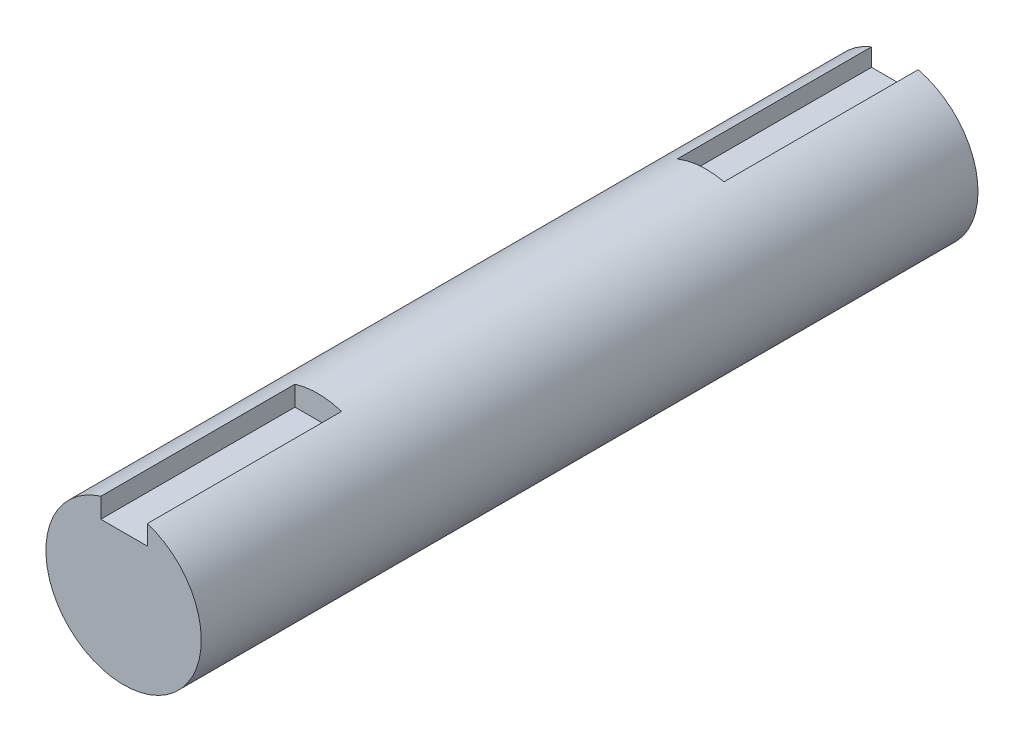
ISO-10303-21;
HEADER;
FILE_DESCRIPTION(('STEP AP214'),'2;1');
FILE_NAME('part.step','',(''),(''),'','','');
FILE_SCHEMA(('AUTOMOTIVE_DESIGN { 1 0 10303 214 1 1 1 1 }'));
ENDSEC;
DATA;
#1=APPLICATION_CONTEXT('core data for automotive mechanical design processes');
#2=APPLICATION_PROTOCOL_DEFINITION('international standard','automotive_design',2000,#1);
#3=PRODUCT_CONTEXT('',#1,'mechanical');
#4=PRODUCT('Part','Part','',(#3));
#5=PRODUCT_RELATED_PRODUCT_CATEGORY('part','',(#4));
#6=PRODUCT_DEFINITION_FORMATION('','',#4);
#7=PRODUCT_DEFINITION_CONTEXT('part definition',#1,'design');
#8=PRODUCT_DEFINITION('design','',#6,#7);
#9=PRODUCT_DEFINITION_SHAPE('','',#8);
#10=(LENGTH_UNIT() NAMED_UNIT(*) SI_UNIT(.MILLI.,.METRE.));
#11=(NAMED_UNIT(*) PLANE_ANGLE_UNIT() SI_UNIT($,.RADIAN.));
#12=(NAMED_UNIT(*) SI_UNIT($,.STERADIAN.) SOLID_ANGLE_UNIT());
#13=UNCERTAINTY_MEASURE_WITH_UNIT(LENGTH_MEASURE(1.E-05),#10,'distance_accuracy_value','');
#14=(GEOMETRIC_REPRESENTATION_CONTEXT(3) GLOBAL_UNCERTAINTY_ASSIGNED_CONTEXT((#13)) GLOBAL_UNIT_ASSIGNED_CONTEXT((#10,
#11,#12)) REPRESENTATION_CONTEXT('',''));
#15=CARTESIAN_POINT('',(0.,0.,0.));
#16=DIRECTION('',(0.,0.,1.));
#17=DIRECTION('',(1.,0.,0.));
#18=AXIS2_PLACEMENT_3D('',#15,#16,#17);
#19=CARTESIAN_POINT('',(0.,0.,0.));
#20=DIRECTION('',(0.,0.,1.));
#21=DIRECTION('',(1.,0.,0.));
#22=AXIS2_PLACEMENT_3D('',#19,#20,#21);
#23=PLANE('',#22);
#24=DIRECTION('',(0.,-1.,0.));
#25=VECTOR('',#24,1.);
#26=CARTESIAN_POINT('',(2.29320418851105,10.,0.));
#27=LINE('',#26,#25);
#28=CARTESIAN_POINT('',(2.29320418851105,9.73350987823999,0.));
#29=VERTEX_POINT('',#28);
#30=CARTESIAN_POINT('',(2.29320418851105,7.,0.));
#31=VERTEX_POINT('',#30);
#32=EDGE_CURVE('E150',#29,#31,#27,.T.);
#33=ORIENTED_EDGE('',*,*,#32,.F.);
#34=CARTESIAN_POINT('',(0.,0.,0.));
#35=DIRECTION('',(0.,0.,1.));
#36=DIRECTION('',(1.,0.,0.));
#37=AXIS2_PLACEMENT_3D('',#34,#35,#36);
#38=CIRCLE('',#37,10.);
#39=CARTESIAN_POINT('',(-3.70679581148895,9.28760813191039,0.));
#40=VERTEX_POINT('',#39);
#41=EDGE_CURVE('E161',#40,#29,#38,.T.);
#42=ORIENTED_EDGE('',*,*,#41,.F.);
#43=DIRECTION('',(0.,1.,0.));
#44=VECTOR('',#43,1.);
#45=CARTESIAN_POINT('',(-3.70679581148895,7.,0.));
#46=LINE('',#45,#44);
#47=CARTESIAN_POINT('',(-3.70679581148895,7.,0.));
#48=VERTEX_POINT('',#47);
#49=EDGE_CURVE('E143',#48,#40,#46,.T.);
#50=ORIENTED_EDGE('',*,*,#49,.F.);
#51=DIRECTION('',(-1.,0.,0.));
#52=VECTOR('',#51,1.);
#53=CARTESIAN_POINT('',(2.29320418851105,7.,0.));
#54=LINE('',#53,#52);
#55=EDGE_CURVE('E140',#31,#48,#54,.T.);
#56=ORIENTED_EDGE('',*,*,#55,.F.);
#57=EDGE_LOOP('',(#33,#42,#50,#56));
#58=FACE_BOUND('',#57,.T.);
#59=ADVANCED_FACE('F39',(#58),#23,.F.);
#60=CARTESIAN_POINT('',(0.,0.,100.));
#61=DIRECTION('',(0.,0.,-1.));
#62=DIRECTION('',(-1.,0.,0.));
#63=AXIS2_PLACEMENT_3D('',#60,#61,#62);
#64=CYLINDRICAL_SURFACE('',#63,10.);
#65=CARTESIAN_POINT('',(0.,0.,100.));
#66=DIRECTION('',(0.,0.,1.));
#67=DIRECTION('',(1.,0.,0.));
#68=AXIS2_PLACEMENT_3D('',#65,#66,#67);
#69=CIRCLE('',#68,10.);
#70=CARTESIAN_POINT('',(-2.93610987251853,9.5592499086748,100.));
#71=VERTEX_POINT('',#70);
#72=CARTESIAN_POINT('',(3.06389012748147,9.51906388710159,100.));
#73=VERTEX_POINT('',#72);
#74=EDGE_CURVE('E149',#71,#73,#69,.T.);
#75=ORIENTED_EDGE('',*,*,#74,.F.);
#76=DIRECTION('',(0.,0.,-1.));
#77=VECTOR('',#76,1.);
#78=CARTESIAN_POINT('',(-2.93610987251853,9.5592499086748,100.));
#79=LINE('',#78,#77);
#80=CARTESIAN_POINT('',(-2.93610987251853,9.5592499086748,75.));
#81=VERTEX_POINT('',#80);
#82=EDGE_CURVE('E134',#71,#81,#79,.T.);
#83=ORIENTED_EDGE('',*,*,#82,.T.);
#84=CARTESIAN_POINT('',(0.,0.,75.));
#85=DIRECTION('',(0.,0.,1.));
#86=DIRECTION('',(1.,0.,0.));
#87=AXIS2_PLACEMENT_3D('',#84,#85,#86);
#88=CIRCLE('',#87,10.);
#89=CARTESIAN_POINT('',(3.06389012748147,9.51906388710159,75.));
#90=VERTEX_POINT('',#89);
#91=EDGE_CURVE('E11',#90,#81,#88,.T.);
#92=ORIENTED_EDGE('',*,*,#91,.F.);
#93=DIRECTION('',(0.,0.,-1.));
#94=VECTOR('',#93,1.);
#95=CARTESIAN_POINT('',(3.06389012748147,9.51906388710158,100.));
#96=LINE('',#95,#94);
#97=EDGE_CURVE('E131',#90,#73,#96,.F.);
#98=ORIENTED_EDGE('',*,*,#97,.T.);
#99=EDGE_LOOP('',(#75,#83,#92,#98));
#100=FACE_BOUND('',#99,.T.);
#101=ORIENTED_EDGE('',*,*,#41,.T.);
#102=DIRECTION('',(0.,0.,-1.));
#103=VECTOR('',#102,1.);
#104=CARTESIAN_POINT('',(2.29320418851105,9.73350987823998,100.));
#105=LINE('',#104,#103);
#106=CARTESIAN_POINT('',(2.29320418851105,9.73350987823999,25.));
#107=VERTEX_POINT('',#106);
#108=EDGE_CURVE('E158',#29,#107,#105,.F.);
#109=ORIENTED_EDGE('',*,*,#108,.T.);
#110=CARTESIAN_POINT('',(0.,0.,25.));
#111=DIRECTION('',(0.,0.,-1.));
#112=DIRECTION('',(-1.,0.,0.));
#113=AXIS2_PLACEMENT_3D('',#110,#111,#112);
#114=CIRCLE('',#113,10.);
#115=CARTESIAN_POINT('',(-3.70679581148895,9.28760813191039,25.));
#116=VERTEX_POINT('',#115);
#117=EDGE_CURVE('E130',#116,#107,#114,.T.);
#118=ORIENTED_EDGE('',*,*,#117,.F.);
#119=DIRECTION('',(0.,0.,-1.));
#120=VECTOR('',#119,1.);
#121=CARTESIAN_POINT('',(-3.70679581148895,9.28760813191039,100.));
#122=LINE('',#121,#120);
#123=EDGE_CURVE('E152',#116,#40,#122,.T.);
#124=ORIENTED_EDGE('',*,*,#123,.T.);
#125=EDGE_LOOP('',(#101,#109,#118,#124));
#126=FACE_BOUND('',#125,.T.);
#127=ADVANCED_FACE('F41',(#100,#126),#64,.T.);
#128=CARTESIAN_POINT('',(0.,0.,100.));
#129=DIRECTION('',(0.,0.,1.));
#130=DIRECTION('',(1.,0.,0.));
#131=AXIS2_PLACEMENT_3D('',#128,#129,#130);
#132=PLANE('',#131);
#133=DIRECTION('',(0.,-1.,0.));
#134=VECTOR('',#133,1.);
#135=CARTESIAN_POINT('',(-2.93610987251853,10.,100.));
#136=LINE('',#135,#134);
#137=CARTESIAN_POINT('',(-2.93610987251853,7.,100.));
#138=VERTEX_POINT('',#137);
#139=EDGE_CURVE('E50',#71,#138,#136,.T.);
#140=ORIENTED_EDGE('',*,*,#139,.F.);
#141=ORIENTED_EDGE('',*,*,#74,.T.);
#142=DIRECTION('',(0.,1.,0.));
#143=VECTOR('',#142,1.);
#144=CARTESIAN_POINT('',(3.06389012748147,7.,100.));
#145=LINE('',#144,#143);
#146=CARTESIAN_POINT('',(3.06389012748147,7.,100.));
#147=VERTEX_POINT('',#146);
#148=EDGE_CURVE('E114',#147,#73,#145,.T.);
#149=ORIENTED_EDGE('',*,*,#148,.F.);
#150=DIRECTION('',(1.,0.,0.));
#151=VECTOR('',#150,1.);
#152=CARTESIAN_POINT('',(-2.93610987251853,7.,100.));
#153=LINE('',#152,#151);
#154=EDGE_CURVE('E126',#138,#147,#153,.T.);
#155=ORIENTED_EDGE('',*,*,#154,.F.);
#156=EDGE_LOOP('',(#140,#141,#149,#155));
#157=FACE_BOUND('',#156,.T.);
#158=ADVANCED_FACE('F194',(#157),#132,.T.);
#159=CARTESIAN_POINT('',(0.,0.,25.));
#160=DIRECTION('',(0.,0.,-1.));
#161=DIRECTION('',(-1.,0.,0.));
#162=AXIS2_PLACEMENT_3D('',#159,#160,#161);
#163=PLANE('',#162);
#164=DIRECTION('',(0.,1.,0.));
#165=VECTOR('',#164,1.);
#166=CARTESIAN_POINT('',(-3.70679581148895,7.,25.));
#167=LINE('',#166,#165);
#168=CARTESIAN_POINT('',(-3.70679581148895,7.,25.));
#169=VERTEX_POINT('',#168);
#170=EDGE_CURVE('E145',#169,#116,#167,.T.);
#171=ORIENTED_EDGE('',*,*,#170,.T.);
#172=ORIENTED_EDGE('',*,*,#117,.T.);
#173=DIRECTION('',(0.,-1.,0.));
#174=VECTOR('',#173,1.);
#175=CARTESIAN_POINT('',(2.29320418851105,10.,25.));
#176=LINE('',#175,#174);
#177=CARTESIAN_POINT('',(2.29320418851105,7.,25.));
#178=VERTEX_POINT('',#177);
#179=EDGE_CURVE('E137',#107,#178,#176,.T.);
#180=ORIENTED_EDGE('',*,*,#179,.T.);
#181=DIRECTION('',(-1.,0.,0.));
#182=VECTOR('',#181,1.);
#183=CARTESIAN_POINT('',(2.29320418851105,7.,25.));
#184=LINE('',#183,#182);
#185=EDGE_CURVE('E139',#178,#169,#184,.T.);
#186=ORIENTED_EDGE('',*,*,#185,.T.);
#187=EDGE_LOOP('',(#171,#172,#180,#186));
#188=FACE_BOUND('',#187,.T.);
#189=ADVANCED_FACE('F170',(#188),#163,.T.);
#190=CARTESIAN_POINT('',(2.29320418851105,10.,25.));
#191=DIRECTION('',(1.,0.,0.));
#192=DIRECTION('',(0.,1.,0.));
#193=AXIS2_PLACEMENT_3D('',#190,#191,#192);
#194=PLANE('',#193);
#195=ORIENTED_EDGE('',*,*,#32,.T.);
#196=DIRECTION('',(0.,0.,-1.));
#197=VECTOR('',#196,1.);
#198=CARTESIAN_POINT('',(2.29320418851105,7.,25.));
#199=LINE('',#198,#197);
#200=EDGE_CURVE('E65',#178,#31,#199,.T.);
#201=ORIENTED_EDGE('',*,*,#200,.F.);
#202=ORIENTED_EDGE('',*,*,#179,.F.);
#203=ORIENTED_EDGE('',*,*,#108,.F.);
#204=EDGE_LOOP('',(#195,#201,#202,#203));
#205=FACE_BOUND('',#204,.T.);
#206=ADVANCED_FACE('F175',(#205),#194,.F.);
#207=CARTESIAN_POINT('',(-3.70679581148895,7.,25.));
#208=DIRECTION('',(-1.,0.,0.));
#209=DIRECTION('',(0.,-1.,0.));
#210=AXIS2_PLACEMENT_3D('',#207,#208,#209);
#211=PLANE('',#210);
#212=ORIENTED_EDGE('',*,*,#170,.F.);
#213=DIRECTION('',(0.,0.,-1.));
#214=VECTOR('',#213,1.);
#215=CARTESIAN_POINT('',(-3.70679581148895,7.,25.));
#216=LINE('',#215,#214);
#217=EDGE_CURVE('E155',#169,#48,#216,.T.);
#218=ORIENTED_EDGE('',*,*,#217,.T.);
#219=ORIENTED_EDGE('',*,*,#49,.T.);
#220=ORIENTED_EDGE('',*,*,#123,.F.);
#221=EDGE_LOOP('',(#212,#218,#219,#220));
#222=FACE_BOUND('',#221,.T.);
#223=ADVANCED_FACE('F179',(#222),#211,.F.);
#224=CARTESIAN_POINT('',(2.29320418851105,7.,25.));
#225=DIRECTION('',(0.,-1.,0.));
#226=DIRECTION('',(0.,0.,-1.));
#227=AXIS2_PLACEMENT_3D('',#224,#225,#226);
#228=PLANE('',#227);
#229=ORIENTED_EDGE('',*,*,#55,.T.);
#230=ORIENTED_EDGE('',*,*,#217,.F.);
#231=ORIENTED_EDGE('',*,*,#185,.F.);
#232=ORIENTED_EDGE('',*,*,#200,.T.);
#233=EDGE_LOOP('',(#229,#230,#231,#232));
#234=FACE_BOUND('',#233,.T.);
#235=ADVANCED_FACE('F177',(#234),#228,.F.);
#236=CARTESIAN_POINT('',(0.,0.,75.));
#237=DIRECTION('',(0.,0.,1.));
#238=DIRECTION('',(1.,0.,0.));
#239=AXIS2_PLACEMENT_3D('',#236,#237,#238);
#240=PLANE('',#239);
#241=DIRECTION('',(0.,1.,0.));
#242=VECTOR('',#241,1.);
#243=CARTESIAN_POINT('',(3.06389012748147,7.,75.));
#244=LINE('',#243,#242);
#245=CARTESIAN_POINT('',(3.06389012748147,7.,75.));
#246=VERTEX_POINT('',#245);
#247=EDGE_CURVE('E118',#246,#90,#244,.T.);
#248=ORIENTED_EDGE('',*,*,#247,.T.);
#249=ORIENTED_EDGE('',*,*,#91,.T.);
#250=DIRECTION('',(0.,-1.,0.));
#251=VECTOR('',#250,1.);
#252=CARTESIAN_POINT('',(-2.93610987251853,10.,75.));
#253=LINE('',#252,#251);
#254=CARTESIAN_POINT('',(-2.93610987251853,7.,75.));
#255=VERTEX_POINT('',#254);
#256=EDGE_CURVE('E110',#81,#255,#253,.T.);
#257=ORIENTED_EDGE('',*,*,#256,.T.);
#258=DIRECTION('',(1.,0.,0.));
#259=VECTOR('',#258,1.);
#260=CARTESIAN_POINT('',(-2.93610987251853,7.,75.));
#261=LINE('',#260,#259);
#262=EDGE_CURVE('E109',#255,#246,#261,.T.);
#263=ORIENTED_EDGE('',*,*,#262,.T.);
#264=EDGE_LOOP('',(#248,#249,#257,#263));
#265=FACE_BOUND('',#264,.T.);
#266=ADVANCED_FACE('F108',(#265),#240,.T.);
#267=CARTESIAN_POINT('',(-2.93610987251853,10.,75.));
#268=DIRECTION('',(-1.,0.,0.));
#269=DIRECTION('',(0.,-1.,0.));
#270=AXIS2_PLACEMENT_3D('',#267,#268,#269);
#271=PLANE('',#270);
#272=ORIENTED_EDGE('',*,*,#139,.T.);
#273=DIRECTION('',(0.,0.,1.));
#274=VECTOR('',#273,1.);
#275=CARTESIAN_POINT('',(-2.93610987251853,7.,75.));
#276=LINE('',#275,#274);
#277=EDGE_CURVE('E53',#255,#138,#276,.T.);
#278=ORIENTED_EDGE('',*,*,#277,.F.);
#279=ORIENTED_EDGE('',*,*,#256,.F.);
#280=ORIENTED_EDGE('',*,*,#82,.F.);
#281=EDGE_LOOP('',(#272,#278,#279,#280));
#282=FACE_BOUND('',#281,.T.);
#283=ADVANCED_FACE('F113',(#282),#271,.F.);
#284=CARTESIAN_POINT('',(3.06389012748147,7.,75.));
#285=DIRECTION('',(1.,0.,0.));
#286=DIRECTION('',(0.,1.,0.));
#287=AXIS2_PLACEMENT_3D('',#284,#285,#286);
#288=PLANE('',#287);
#289=ORIENTED_EDGE('',*,*,#247,.F.);
#290=DIRECTION('',(0.,0.,1.));
#291=VECTOR('',#290,1.);
#292=CARTESIAN_POINT('',(3.06389012748147,7.,75.));
#293=LINE('',#292,#291);
#294=EDGE_CURVE('E117',#246,#147,#293,.T.);
#295=ORIENTED_EDGE('',*,*,#294,.T.);
#296=ORIENTED_EDGE('',*,*,#148,.T.);
#297=ORIENTED_EDGE('',*,*,#97,.F.);
#298=EDGE_LOOP('',(#289,#295,#296,#297));
#299=FACE_BOUND('',#298,.T.);
#300=ADVANCED_FACE('F210',(#299),#288,.F.);
#301=CARTESIAN_POINT('',(-2.93610987251853,7.,75.));
#302=DIRECTION('',(0.,-1.,0.));
#303=DIRECTION('',(0.,0.,-1.));
#304=AXIS2_PLACEMENT_3D('',#301,#302,#303);
#305=PLANE('',#304);
#306=ORIENTED_EDGE('',*,*,#154,.T.);
#307=ORIENTED_EDGE('',*,*,#294,.F.);
#308=ORIENTED_EDGE('',*,*,#262,.F.);
#309=ORIENTED_EDGE('',*,*,#277,.T.);
#310=EDGE_LOOP('',(#306,#307,#308,#309));
#311=FACE_BOUND('',#310,.T.);
#312=ADVANCED_FACE('F121',(#311),#305,.F.);
#313=CLOSED_SHELL('',(#59,#127,#158,#189,#206,#223,#235,#266,#283,#300,#312));
#314=MANIFOLD_SOLID_BREP('B2',#313);
#315=ADVANCED_BREP_SHAPE_REPRESENTATION('',(#18,#314),#14);
#316=SHAPE_DEFINITION_REPRESENTATION(#9,#315);
ENDSEC;
END-ISO-10303-21;
